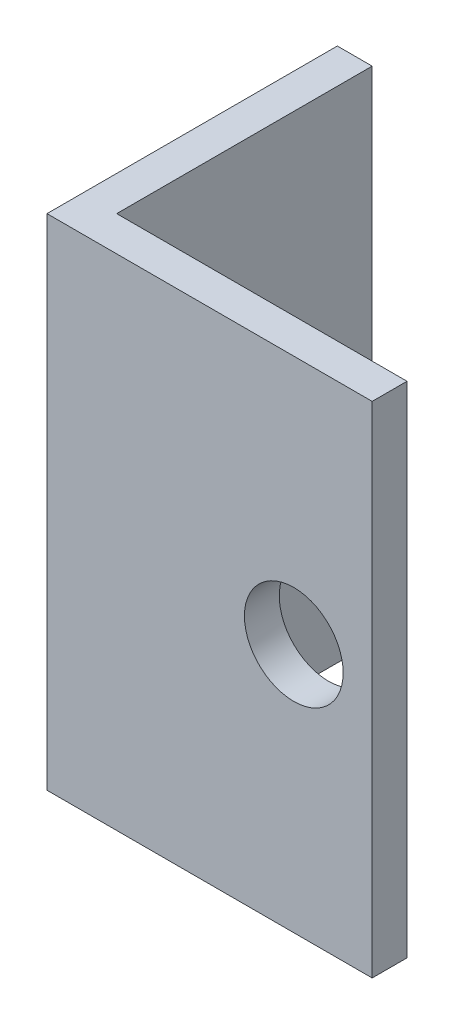
ISO-10303-21;
HEADER;
FILE_DESCRIPTION(('STEP AP214'),'2;1');
FILE_NAME('part.step','',(''),(''),'','','');
FILE_SCHEMA(('AUTOMOTIVE_DESIGN { 1 0 10303 214 1 1 1 1 }'));
ENDSEC;
DATA;
#1=APPLICATION_CONTEXT('core data for automotive mechanical design processes');
#2=APPLICATION_PROTOCOL_DEFINITION('international standard','automotive_design',2000,#1);
#3=PRODUCT_CONTEXT('',#1,'mechanical');
#4=PRODUCT('Part','Part','',(#3));
#5=PRODUCT_RELATED_PRODUCT_CATEGORY('part','',(#4));
#6=PRODUCT_DEFINITION_FORMATION('','',#4);
#7=PRODUCT_DEFINITION_CONTEXT('part definition',#1,'design');
#8=PRODUCT_DEFINITION('design','',#6,#7);
#9=PRODUCT_DEFINITION_SHAPE('','',#8);
#10=(LENGTH_UNIT() NAMED_UNIT(*) SI_UNIT(.MILLI.,.METRE.));
#11=(NAMED_UNIT(*) PLANE_ANGLE_UNIT() SI_UNIT($,.RADIAN.));
#12=(NAMED_UNIT(*) SI_UNIT($,.STERADIAN.) SOLID_ANGLE_UNIT());
#13=UNCERTAINTY_MEASURE_WITH_UNIT(LENGTH_MEASURE(1.E-05),#10,'distance_accuracy_value','');
#14=(GEOMETRIC_REPRESENTATION_CONTEXT(3) GLOBAL_UNCERTAINTY_ASSIGNED_CONTEXT((#13)) GLOBAL_UNIT_ASSIGNED_CONTEXT((#10,
#11,#12)) REPRESENTATION_CONTEXT('',''));
#15=CARTESIAN_POINT('',(0.,0.,0.));
#16=DIRECTION('',(0.,0.,1.));
#17=DIRECTION('',(1.,0.,0.));
#18=AXIS2_PLACEMENT_3D('',#15,#16,#17);
#19=CARTESIAN_POINT('',(0.,195.,0.));
#20=DIRECTION('',(0.,-1.,0.));
#21=DIRECTION('',(0.,0.,-1.));
#22=AXIS2_PLACEMENT_3D('',#19,#20,#21);
#23=PLANE('',#22);
#24=DIRECTION('',(0.,0.,1.));
#25=VECTOR('',#24,1.);
#26=CARTESIAN_POINT('',(-3.,195.,0.));
#27=LINE('',#26,#25);
#28=CARTESIAN_POINT('',(-3.,195.,-22.));
#29=VERTEX_POINT('',#28);
#30=CARTESIAN_POINT('',(-3.,195.,3.));
#31=VERTEX_POINT('',#30);
#32=EDGE_CURVE('E108',#29,#31,#27,.T.);
#33=ORIENTED_EDGE('',*,*,#32,.T.);
#34=DIRECTION('',(-1.,0.,0.));
#35=VECTOR('',#34,1.);
#36=CARTESIAN_POINT('',(-3.,195.,3.));
#37=LINE('',#36,#35);
#38=CARTESIAN_POINT('',(25.,195.,3.));
#39=VERTEX_POINT('',#38);
#40=EDGE_CURVE('E55',#39,#31,#37,.T.);
#41=ORIENTED_EDGE('',*,*,#40,.F.);
#42=DIRECTION('',(0.,0.,-1.));
#43=VECTOR('',#42,1.);
#44=CARTESIAN_POINT('',(25.,195.,0.));
#45=LINE('',#44,#43);
#46=CARTESIAN_POINT('',(25.,195.,0.));
#47=VERTEX_POINT('',#46);
#48=EDGE_CURVE('E105',#39,#47,#45,.T.);
#49=ORIENTED_EDGE('',*,*,#48,.T.);
#50=DIRECTION('',(-1.,0.,0.));
#51=VECTOR('',#50,1.);
#52=CARTESIAN_POINT('',(0.,195.,0.));
#53=LINE('',#52,#51);
#54=CARTESIAN_POINT('',(0.,195.,0.));
#55=VERTEX_POINT('',#54);
#56=EDGE_CURVE('E115',#47,#55,#53,.T.);
#57=ORIENTED_EDGE('',*,*,#56,.T.);
#58=DIRECTION('',(0.,0.,-1.));
#59=VECTOR('',#58,1.);
#60=CARTESIAN_POINT('',(0.,195.,3.));
#61=LINE('',#60,#59);
#62=CARTESIAN_POINT('',(0.,195.,-22.));
#63=VERTEX_POINT('',#62);
#64=EDGE_CURVE('E156',#55,#63,#61,.T.);
#65=ORIENTED_EDGE('',*,*,#64,.T.);
#66=DIRECTION('',(-1.,0.,0.));
#67=VECTOR('',#66,1.);
#68=CARTESIAN_POINT('',(0.,195.,-22.));
#69=LINE('',#68,#67);
#70=EDGE_CURVE('E122',#63,#29,#69,.T.);
#71=ORIENTED_EDGE('',*,*,#70,.T.);
#72=EDGE_LOOP('',(#33,#41,#49,#57,#65,#71));
#73=FACE_BOUND('',#72,.T.);
#74=ADVANCED_FACE('F40',(#73),#23,.F.);
#75=CARTESIAN_POINT('',(0.,0.,-22.));
#76=DIRECTION('',(0.,0.,-1.));
#77=DIRECTION('',(-1.,0.,0.));
#78=AXIS2_PLACEMENT_3D('',#75,#76,#77);
#79=PLANE('',#78);
#80=DIRECTION('',(1.,0.,0.));
#81=VECTOR('',#80,1.);
#82=CARTESIAN_POINT('',(0.,152.,-22.));
#83=LINE('',#82,#81);
#84=CARTESIAN_POINT('',(-3.,152.,-22.));
#85=VERTEX_POINT('',#84);
#86=CARTESIAN_POINT('',(0.,152.,-22.));
#87=VERTEX_POINT('',#86);
#88=EDGE_CURVE('E135',#85,#87,#83,.T.);
#89=ORIENTED_EDGE('',*,*,#88,.F.);
#90=DIRECTION('',(0.,1.,0.));
#91=VECTOR('',#90,1.);
#92=CARTESIAN_POINT('',(-3.,135.,-22.));
#93=LINE('',#92,#91);
#94=EDGE_CURVE('E63',#85,#29,#93,.T.);
#95=ORIENTED_EDGE('',*,*,#94,.T.);
#96=ORIENTED_EDGE('',*,*,#70,.F.);
#97=DIRECTION('',(0.,1.,0.));
#98=VECTOR('',#97,1.);
#99=CARTESIAN_POINT('',(0.,0.,-22.));
#100=LINE('',#99,#98);
#101=EDGE_CURVE('E116',#87,#63,#100,.T.);
#102=ORIENTED_EDGE('',*,*,#101,.F.);
#103=EDGE_LOOP('',(#89,#95,#96,#102));
#104=FACE_BOUND('',#103,.T.);
#105=ADVANCED_FACE('F139',(#104),#79,.T.);
#106=CARTESIAN_POINT('',(25.,152.,-36.));
#107=DIRECTION('',(0.,1.,0.));
#108=DIRECTION('',(-1.,0.,0.));
#109=AXIS2_PLACEMENT_3D('',#106,#107,#108);
#110=PLANE('',#109);
#111=DIRECTION('',(0.,0.,1.));
#112=VECTOR('',#111,1.);
#113=CARTESIAN_POINT('',(25.,152.,-36.));
#114=LINE('',#113,#112);
#115=CARTESIAN_POINT('',(25.,152.,0.));
#116=VERTEX_POINT('',#115);
#117=CARTESIAN_POINT('',(25.,152.,3.));
#118=VERTEX_POINT('',#117);
#119=EDGE_CURVE('E143',#116,#118,#114,.T.);
#120=ORIENTED_EDGE('',*,*,#119,.T.);
#121=DIRECTION('',(-1.,0.,0.));
#122=VECTOR('',#121,1.);
#123=CARTESIAN_POINT('',(25.,152.,3.));
#124=LINE('',#123,#122);
#125=CARTESIAN_POINT('',(-3.,152.,3.));
#126=VERTEX_POINT('',#125);
#127=EDGE_CURVE('E95',#118,#126,#124,.T.);
#128=ORIENTED_EDGE('',*,*,#127,.T.);
#129=DIRECTION('',(0.,0.,1.));
#130=VECTOR('',#129,1.);
#131=CARTESIAN_POINT('',(-3.,152.,-36.));
#132=LINE('',#131,#130);
#133=EDGE_CURVE('E49',#85,#126,#132,.T.);
#134=ORIENTED_EDGE('',*,*,#133,.F.);
#135=ORIENTED_EDGE('',*,*,#88,.T.);
#136=DIRECTION('',(0.,0.,1.));
#137=VECTOR('',#136,1.);
#138=CARTESIAN_POINT('',(0.,152.,3.));
#139=LINE('',#138,#137);
#140=CARTESIAN_POINT('',(0.,152.,0.));
#141=VERTEX_POINT('',#140);
#142=EDGE_CURVE('E142',#87,#141,#139,.T.);
#143=ORIENTED_EDGE('',*,*,#142,.T.);
#144=DIRECTION('',(-1.,0.,0.));
#145=VECTOR('',#144,1.);
#146=CARTESIAN_POINT('',(0.,152.,0.));
#147=LINE('',#146,#145);
#148=EDGE_CURVE('E147',#116,#141,#147,.T.);
#149=ORIENTED_EDGE('',*,*,#148,.F.);
#150=EDGE_LOOP('',(#120,#128,#134,#135,#143,#149));
#151=FACE_BOUND('',#150,.T.);
#152=ADVANCED_FACE('F134',(#151),#110,.F.);
#153=CARTESIAN_POINT('',(25.,195.,0.));
#154=DIRECTION('',(-1.,0.,0.));
#155=DIRECTION('',(0.,0.,1.));
#156=AXIS2_PLACEMENT_3D('',#153,#154,#155);
#157=PLANE('',#156);
#158=ORIENTED_EDGE('',*,*,#48,.F.);
#159=DIRECTION('',(0.,1.,0.));
#160=VECTOR('',#159,1.);
#161=CARTESIAN_POINT('',(25.,135.,3.));
#162=LINE('',#161,#160);
#163=EDGE_CURVE('E92',#118,#39,#162,.T.);
#164=ORIENTED_EDGE('',*,*,#163,.F.);
#165=ORIENTED_EDGE('',*,*,#119,.F.);
#166=DIRECTION('',(0.,-1.,0.));
#167=VECTOR('',#166,1.);
#168=CARTESIAN_POINT('',(25.,195.,0.));
#169=LINE('',#168,#167);
#170=EDGE_CURVE('E112',#47,#116,#169,.T.);
#171=ORIENTED_EDGE('',*,*,#170,.F.);
#172=EDGE_LOOP('',(#158,#164,#165,#171));
#173=FACE_BOUND('',#172,.T.);
#174=ADVANCED_FACE('F42',(#173),#157,.F.);
#175=CARTESIAN_POINT('',(0.,195.,0.));
#176=DIRECTION('',(0.,0.,1.));
#177=DIRECTION('',(1.,0.,0.));
#178=AXIS2_PLACEMENT_3D('',#175,#176,#177);
#179=PLANE('',#178);
#180=CARTESIAN_POINT('',(18.25,173.5,0.));
#181=DIRECTION('',(0.,0.,1.));
#182=DIRECTION('',(1.,0.,0.));
#183=AXIS2_PLACEMENT_3D('',#180,#181,#182);
#184=CIRCLE('',#183,4.25000000000001);
#185=CARTESIAN_POINT('',(22.5,173.5,0.));
#186=VERTEX_POINT('',#185);
#187=EDGE_CURVE('E149',#186,#186,#184,.T.);
#188=ORIENTED_EDGE('',*,*,#187,.T.);
#189=EDGE_LOOP('',(#188));
#190=FACE_BOUND('',#189,.T.);
#191=ORIENTED_EDGE('',*,*,#170,.T.);
#192=ORIENTED_EDGE('',*,*,#148,.T.);
#193=DIRECTION('',(0.,-1.,0.));
#194=VECTOR('',#193,1.);
#195=CARTESIAN_POINT('',(0.,195.,0.));
#196=LINE('',#195,#194);
#197=EDGE_CURVE('E120',#55,#141,#196,.T.);
#198=ORIENTED_EDGE('',*,*,#197,.F.);
#199=ORIENTED_EDGE('',*,*,#56,.F.);
#200=EDGE_LOOP('',(#191,#192,#198,#199));
#201=FACE_BOUND('',#200,.T.);
#202=ADVANCED_FACE('F165',(#190,#201),#179,.F.);
#203=CARTESIAN_POINT('',(0.,0.,3.));
#204=DIRECTION('',(1.,0.,0.));
#205=DIRECTION('',(0.,0.,-1.));
#206=AXIS2_PLACEMENT_3D('',#203,#204,#205);
#207=PLANE('',#206);
#208=ORIENTED_EDGE('',*,*,#142,.F.);
#209=ORIENTED_EDGE('',*,*,#101,.T.);
#210=ORIENTED_EDGE('',*,*,#64,.F.);
#211=ORIENTED_EDGE('',*,*,#197,.T.);
#212=EDGE_LOOP('',(#208,#209,#210,#211));
#213=FACE_BOUND('',#212,.T.);
#214=ADVANCED_FACE('F163',(#213),#207,.T.);
#215=CARTESIAN_POINT('',(18.25,173.5,-36.));
#216=DIRECTION('',(0.,0.,1.));
#217=DIRECTION('',(1.,0.,0.));
#218=AXIS2_PLACEMENT_3D('',#215,#216,#217);
#219=CYLINDRICAL_SURFACE('',#218,4.25000000000001);
#220=CARTESIAN_POINT('',(18.25,173.5,3.));
#221=DIRECTION('',(0.,0.,-1.));
#222=DIRECTION('',(-1.,0.,0.));
#223=AXIS2_PLACEMENT_3D('',#220,#221,#222);
#224=CIRCLE('',#223,4.25000000000001);
#225=CARTESIAN_POINT('',(14.,173.5,3.));
#226=VERTEX_POINT('',#225);
#227=EDGE_CURVE('E101',#226,#226,#224,.F.);
#228=ORIENTED_EDGE('',*,*,#227,.T.);
#229=EDGE_LOOP('',(#228));
#230=FACE_BOUND('',#229,.T.);
#231=ORIENTED_EDGE('',*,*,#187,.F.);
#232=EDGE_LOOP('',(#231));
#233=FACE_BOUND('',#232,.T.);
#234=ADVANCED_FACE('F172',(#230,#233),#219,.F.);
#235=CARTESIAN_POINT('',(-3.,135.,0.));
#236=DIRECTION('',(-1.,0.,0.));
#237=DIRECTION('',(0.,0.,1.));
#238=AXIS2_PLACEMENT_3D('',#235,#236,#237);
#239=PLANE('',#238);
#240=DIRECTION('',(0.,-1.,0.));
#241=VECTOR('',#240,1.);
#242=CARTESIAN_POINT('',(-3.,135.,3.));
#243=LINE('',#242,#241);
#244=EDGE_CURVE('E11',#31,#126,#243,.T.);
#245=ORIENTED_EDGE('',*,*,#244,.F.);
#246=ORIENTED_EDGE('',*,*,#32,.F.);
#247=ORIENTED_EDGE('',*,*,#94,.F.);
#248=ORIENTED_EDGE('',*,*,#133,.T.);
#249=EDGE_LOOP('',(#245,#246,#247,#248));
#250=FACE_BOUND('',#249,.T.);
#251=ADVANCED_FACE('F131',(#250),#239,.T.);
#252=CARTESIAN_POINT('',(-3.,135.,3.));
#253=DIRECTION('',(0.,0.,-1.));
#254=DIRECTION('',(-1.,0.,0.));
#255=AXIS2_PLACEMENT_3D('',#252,#253,#254);
#256=PLANE('',#255);
#257=ORIENTED_EDGE('',*,*,#227,.F.);
#258=EDGE_LOOP('',(#257));
#259=FACE_BOUND('',#258,.T.);
#260=ORIENTED_EDGE('',*,*,#163,.T.);
#261=ORIENTED_EDGE('',*,*,#40,.T.);
#262=ORIENTED_EDGE('',*,*,#244,.T.);
#263=ORIENTED_EDGE('',*,*,#127,.F.);
#264=EDGE_LOOP('',(#260,#261,#262,#263));
#265=FACE_BOUND('',#264,.T.);
#266=ADVANCED_FACE('F93',(#259,#265),#256,.F.);
#267=CLOSED_SHELL('',(#74,#105,#152,#174,#202,#214,#234,#251,#266));
#268=MANIFOLD_SOLID_BREP('B2',#267);
#269=ADVANCED_BREP_SHAPE_REPRESENTATION('',(#18,#268),#14);
#270=SHAPE_DEFINITION_REPRESENTATION(#9,#269);
ENDSEC;
END-ISO-10303-21;
